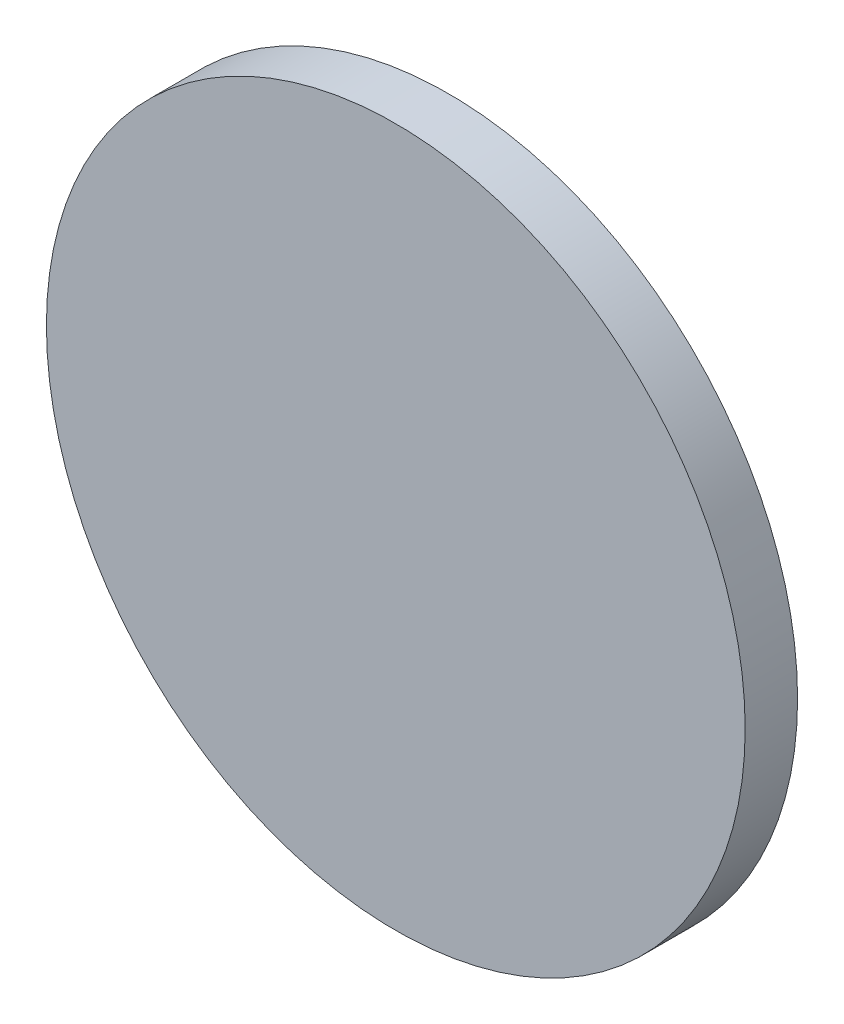
ISO-10303-21;
HEADER;
FILE_DESCRIPTION(('STEP AP214'),'2;1');
FILE_NAME('part.step','',(''),(''),'','','');
FILE_SCHEMA(('AUTOMOTIVE_DESIGN { 1 0 10303 214 1 1 1 1 }'));
ENDSEC;
DATA;
#1=APPLICATION_CONTEXT('core data for automotive mechanical design processes');
#2=APPLICATION_PROTOCOL_DEFINITION('international standard','automotive_design',2000,#1);
#3=PRODUCT_CONTEXT('',#1,'mechanical');
#4=PRODUCT('Part','Part','',(#3));
#5=PRODUCT_RELATED_PRODUCT_CATEGORY('part','',(#4));
#6=PRODUCT_DEFINITION_FORMATION('','',#4);
#7=PRODUCT_DEFINITION_CONTEXT('part definition',#1,'design');
#8=PRODUCT_DEFINITION('design','',#6,#7);
#9=PRODUCT_DEFINITION_SHAPE('','',#8);
#10=(LENGTH_UNIT() NAMED_UNIT(*) SI_UNIT(.MILLI.,.METRE.));
#11=(NAMED_UNIT(*) PLANE_ANGLE_UNIT() SI_UNIT($,.RADIAN.));
#12=(NAMED_UNIT(*) SI_UNIT($,.STERADIAN.) SOLID_ANGLE_UNIT());
#13=UNCERTAINTY_MEASURE_WITH_UNIT(LENGTH_MEASURE(1.E-05),#10,'distance_accuracy_value','');
#14=(GEOMETRIC_REPRESENTATION_CONTEXT(3) GLOBAL_UNCERTAINTY_ASSIGNED_CONTEXT((#13)) GLOBAL_UNIT_ASSIGNED_CONTEXT((#10,
#11,#12)) REPRESENTATION_CONTEXT('',''));
#15=CARTESIAN_POINT('',(0.,0.,0.));
#16=DIRECTION('',(0.,0.,1.));
#17=DIRECTION('',(1.,0.,0.));
#18=AXIS2_PLACEMENT_3D('',#15,#16,#17);
#19=CARTESIAN_POINT('',(0.,0.,3.));
#20=DIRECTION('',(0.,0.,-1.));
#21=DIRECTION('',(-1.,0.,0.));
#22=AXIS2_PLACEMENT_3D('',#19,#20,#21);
#23=CYLINDRICAL_SURFACE('',#22,20.);
#24=CARTESIAN_POINT('',(0.,0.,3.));
#25=DIRECTION('',(0.,0.,1.));
#26=DIRECTION('',(1.,0.,0.));
#27=AXIS2_PLACEMENT_3D('',#24,#25,#26);
#28=CIRCLE('',#27,20.);
#29=CARTESIAN_POINT('',(20.,0.,3.));
#30=VERTEX_POINT('',#29);
#31=EDGE_CURVE('E10',#30,#30,#28,.T.);
#32=ORIENTED_EDGE('',*,*,#31,.F.);
#33=EDGE_LOOP('',(#32));
#34=FACE_BOUND('',#33,.T.);
#35=CARTESIAN_POINT('',(0.,0.,0.));
#36=DIRECTION('',(0.,0.,1.));
#37=DIRECTION('',(1.,0.,0.));
#38=AXIS2_PLACEMENT_3D('',#35,#36,#37);
#39=CIRCLE('',#38,20.);
#40=CARTESIAN_POINT('',(20.,0.,0.));
#41=VERTEX_POINT('',#40);
#42=EDGE_CURVE('E42',#41,#41,#39,.T.);
#43=ORIENTED_EDGE('',*,*,#42,.T.);
#44=EDGE_LOOP('',(#43));
#45=FACE_BOUND('',#44,.T.);
#46=ADVANCED_FACE('F39',(#34,#45),#23,.T.);
#47=CARTESIAN_POINT('',(0.,0.,3.));
#48=DIRECTION('',(0.,0.,1.));
#49=DIRECTION('',(1.,0.,0.));
#50=AXIS2_PLACEMENT_3D('',#47,#48,#49);
#51=PLANE('',#50);
#52=ORIENTED_EDGE('',*,*,#31,.T.);
#53=EDGE_LOOP('',(#52));
#54=FACE_BOUND('',#53,.T.);
#55=ADVANCED_FACE('F54',(#54),#51,.T.);
#56=CARTESIAN_POINT('',(0.,0.,0.));
#57=DIRECTION('',(0.,0.,1.));
#58=DIRECTION('',(1.,0.,0.));
#59=AXIS2_PLACEMENT_3D('',#56,#57,#58);
#60=PLANE('',#59);
#61=ORIENTED_EDGE('',*,*,#42,.F.);
#62=EDGE_LOOP('',(#61));
#63=FACE_BOUND('',#62,.T.);
#64=ADVANCED_FACE('F52',(#63),#60,.F.);
#65=CLOSED_SHELL('',(#46,#55,#64));
#66=MANIFOLD_SOLID_BREP('B2',#65);
#67=ADVANCED_BREP_SHAPE_REPRESENTATION('',(#18,#66),#14);
#68=SHAPE_DEFINITION_REPRESENTATION(#9,#67);
ENDSEC;
END-ISO-10303-21;
